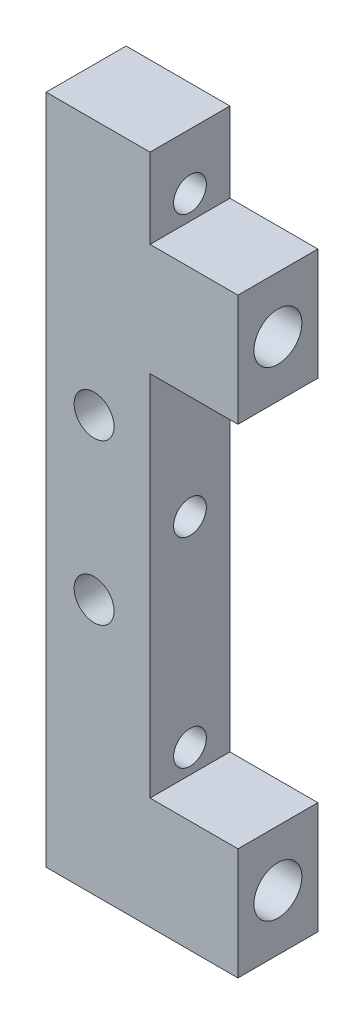
ISO-10303-21;
HEADER;
FILE_DESCRIPTION(('STEP AP214'),'2;1');
FILE_NAME('part.step','',(''),(''),'','','');
FILE_SCHEMA(('AUTOMOTIVE_DESIGN { 1 0 10303 214 1 1 1 1 }'));
ENDSEC;
DATA;
#1=APPLICATION_CONTEXT('core data for automotive mechanical design processes');
#2=APPLICATION_PROTOCOL_DEFINITION('international standard','automotive_design',2000,#1);
#3=PRODUCT_CONTEXT('',#1,'mechanical');
#4=PRODUCT('Part','Part','',(#3));
#5=PRODUCT_RELATED_PRODUCT_CATEGORY('part','',(#4));
#6=PRODUCT_DEFINITION_FORMATION('','',#4);
#7=PRODUCT_DEFINITION_CONTEXT('part definition',#1,'design');
#8=PRODUCT_DEFINITION('design','',#6,#7);
#9=PRODUCT_DEFINITION_SHAPE('','',#8);
#10=(LENGTH_UNIT() NAMED_UNIT(*) SI_UNIT(.MILLI.,.METRE.));
#11=(NAMED_UNIT(*) PLANE_ANGLE_UNIT() SI_UNIT($,.RADIAN.));
#12=(NAMED_UNIT(*) SI_UNIT($,.STERADIAN.) SOLID_ANGLE_UNIT());
#13=UNCERTAINTY_MEASURE_WITH_UNIT(LENGTH_MEASURE(1.E-05),#10,'distance_accuracy_value','');
#14=(GEOMETRIC_REPRESENTATION_CONTEXT(3) GLOBAL_UNCERTAINTY_ASSIGNED_CONTEXT((#13)) GLOBAL_UNIT_ASSIGNED_CONTEXT((#10,
#11,#12)) REPRESENTATION_CONTEXT('',''));
#15=CARTESIAN_POINT('',(0.,0.,0.));
#16=DIRECTION('',(0.,0.,1.));
#17=DIRECTION('',(1.,0.,0.));
#18=AXIS2_PLACEMENT_3D('',#15,#16,#17);
#19=CARTESIAN_POINT('',(6.,-21.,2.5));
#20=DIRECTION('',(1.,0.,0.));
#21=DIRECTION('',(0.,0.,-1.));
#22=AXIS2_PLACEMENT_3D('',#19,#20,#21);
#23=PLANE('',#22);
#24=CARTESIAN_POINT('',(6.,-17.5,0.));
#25=DIRECTION('',(1.,0.,0.));
#26=DIRECTION('',(0.,0.,-1.));
#27=AXIS2_PLACEMENT_3D('',#24,#25,#26);
#28=CIRCLE('',#27,1.49999999999999);
#29=CARTESIAN_POINT('',(6.,-17.5,-1.50000000000008));
#30=VERTEX_POINT('',#29);
#31=EDGE_CURVE('E182',#30,#30,#28,.T.);
#32=ORIENTED_EDGE('',*,*,#31,.F.);
#33=EDGE_LOOP('',(#32));
#34=FACE_BOUND('',#33,.T.);
#35=DIRECTION('',(0.,1.,0.));
#36=VECTOR('',#35,1.);
#37=CARTESIAN_POINT('',(6.,21.,-2.5));
#38=LINE('',#37,#36);
#39=CARTESIAN_POINT('',(6.,-21.,-2.5));
#40=VERTEX_POINT('',#39);
#41=CARTESIAN_POINT('',(6.,-14.,-2.5));
#42=VERTEX_POINT('',#41);
#43=EDGE_CURVE('E194',#40,#42,#38,.T.);
#44=ORIENTED_EDGE('',*,*,#43,.T.);
#45=DIRECTION('',(0.,0.,-1.));
#46=VECTOR('',#45,1.);
#47=CARTESIAN_POINT('',(6.,-14.,2.5));
#48=LINE('',#47,#46);
#49=CARTESIAN_POINT('',(6.,-14.,2.5));
#50=VERTEX_POINT('',#49);
#51=EDGE_CURVE('E152',#50,#42,#48,.T.);
#52=ORIENTED_EDGE('',*,*,#51,.F.);
#53=DIRECTION('',(0.,-1.,0.));
#54=VECTOR('',#53,1.);
#55=CARTESIAN_POINT('',(6.,21.,2.5));
#56=LINE('',#55,#54);
#57=CARTESIAN_POINT('',(6.,-21.,2.5));
#58=VERTEX_POINT('',#57);
#59=EDGE_CURVE('E188',#50,#58,#56,.T.);
#60=ORIENTED_EDGE('',*,*,#59,.T.);
#61=DIRECTION('',(0.,0.,-1.));
#62=VECTOR('',#61,1.);
#63=CARTESIAN_POINT('',(6.,-21.,2.5));
#64=LINE('',#63,#62);
#65=EDGE_CURVE('E191',#58,#40,#64,.T.);
#66=ORIENTED_EDGE('',*,*,#65,.T.);
#67=EDGE_LOOP('',(#44,#52,#60,#66));
#68=FACE_BOUND('',#67,.T.);
#69=ADVANCED_FACE('F32',(#34,#68),#23,.T.);
#70=CARTESIAN_POINT('',(6.,12.5,-3.59157148466238E-13));
#71=DIRECTION('',(1.,0.,0.));
#72=DIRECTION('',(0.,0.,-1.));
#73=AXIS2_PLACEMENT_3D('',#70,#71,#72);
#74=CIRCLE('',#73,1.49999999999959);
#75=CARTESIAN_POINT('',(6.,12.5,-1.49999999999995));
#76=VERTEX_POINT('',#75);
#77=EDGE_CURVE('E176',#76,#76,#74,.T.);
#78=ORIENTED_EDGE('',*,*,#77,.F.);
#79=EDGE_LOOP('',(#78));
#80=FACE_BOUND('',#79,.T.);
#81=CARTESIAN_POINT('',(6.,16.,2.5));
#82=VERTEX_POINT('',#81);
#83=CARTESIAN_POINT('',(6.,9.,2.5));
#84=VERTEX_POINT('',#83);
#85=EDGE_CURVE('E131',#82,#84,#56,.T.);
#86=ORIENTED_EDGE('',*,*,#85,.T.);
#87=DIRECTION('',(0.,0.,-1.));
#88=VECTOR('',#87,1.);
#89=CARTESIAN_POINT('',(6.,9.,2.5));
#90=LINE('',#89,#88);
#91=CARTESIAN_POINT('',(6.,9.,-2.5));
#92=VERTEX_POINT('',#91);
#93=EDGE_CURVE('E159',#84,#92,#90,.T.);
#94=ORIENTED_EDGE('',*,*,#93,.T.);
#95=CARTESIAN_POINT('',(6.,16.,-2.5));
#96=VERTEX_POINT('',#95);
#97=EDGE_CURVE('E193',#92,#96,#38,.T.);
#98=ORIENTED_EDGE('',*,*,#97,.T.);
#99=DIRECTION('',(0.,0.,-1.));
#100=VECTOR('',#99,1.);
#101=CARTESIAN_POINT('',(6.,16.,2.5));
#102=LINE('',#101,#100);
#103=EDGE_CURVE('E117',#82,#96,#102,.T.);
#104=ORIENTED_EDGE('',*,*,#103,.F.);
#105=EDGE_LOOP('',(#86,#94,#98,#104));
#106=FACE_BOUND('',#105,.T.);
#107=ADVANCED_FACE('F229',(#80,#106),#23,.T.);
#108=CARTESIAN_POINT('',(6.,21.,2.5));
#109=DIRECTION('',(0.,0.,-1.));
#110=DIRECTION('',(0.,1.,0.));
#111=AXIS2_PLACEMENT_3D('',#108,#109,#110);
#112=PLANE('',#111);
#113=CARTESIAN_POINT('',(-3.,5.,2.5));
#114=DIRECTION('',(0.,0.,-1.));
#115=DIRECTION('',(0.,1.,0.));
#116=AXIS2_PLACEMENT_3D('',#113,#114,#115);
#117=CIRCLE('',#116,1.25);
#118=CARTESIAN_POINT('',(-3.,6.25,2.5));
#119=VERTEX_POINT('',#118);
#120=EDGE_CURVE('E166',#119,#119,#117,.T.);
#121=ORIENTED_EDGE('',*,*,#120,.T.);
#122=EDGE_LOOP('',(#121));
#123=FACE_BOUND('',#122,.T.);
#124=CARTESIAN_POINT('',(-3.,-5.,2.5));
#125=DIRECTION('',(0.,0.,-1.));
#126=DIRECTION('',(0.,1.,0.));
#127=AXIS2_PLACEMENT_3D('',#124,#125,#126);
#128=CIRCLE('',#127,1.25);
#129=CARTESIAN_POINT('',(-3.,-3.75,2.5));
#130=VERTEX_POINT('',#129);
#131=EDGE_CURVE('E172',#130,#130,#128,.T.);
#132=ORIENTED_EDGE('',*,*,#131,.T.);
#133=EDGE_LOOP('',(#132));
#134=FACE_BOUND('',#133,.T.);
#135=DIRECTION('',(1.,0.,0.));
#136=VECTOR('',#135,1.);
#137=CARTESIAN_POINT('',(0.499999999999998,-14.,2.5));
#138=LINE('',#137,#136);
#139=CARTESIAN_POINT('',(0.499999999999998,-14.,2.5));
#140=VERTEX_POINT('',#139);
#141=EDGE_CURVE('E141',#140,#50,#138,.T.);
#142=ORIENTED_EDGE('',*,*,#141,.F.);
#143=DIRECTION('',(0.,-1.,0.));
#144=VECTOR('',#143,1.);
#145=CARTESIAN_POINT('',(0.5,9.,2.5));
#146=LINE('',#145,#144);
#147=CARTESIAN_POINT('',(0.5,9.,2.5));
#148=VERTEX_POINT('',#147);
#149=EDGE_CURVE('E135',#148,#140,#146,.T.);
#150=ORIENTED_EDGE('',*,*,#149,.F.);
#151=DIRECTION('',(-1.,0.,0.));
#152=VECTOR('',#151,1.);
#153=CARTESIAN_POINT('',(6.,9.,2.5));
#154=LINE('',#153,#152);
#155=EDGE_CURVE('E132',#84,#148,#154,.T.);
#156=ORIENTED_EDGE('',*,*,#155,.F.);
#157=ORIENTED_EDGE('',*,*,#85,.F.);
#158=DIRECTION('',(1.,0.,0.));
#159=VECTOR('',#158,1.);
#160=CARTESIAN_POINT('',(0.500000000000001,16.,2.5));
#161=LINE('',#160,#159);
#162=CARTESIAN_POINT('',(0.500000000000001,16.,2.5));
#163=VERTEX_POINT('',#162);
#164=EDGE_CURVE('E113',#163,#82,#161,.T.);
#165=ORIENTED_EDGE('',*,*,#164,.F.);
#166=DIRECTION('',(0.,-1.,0.));
#167=VECTOR('',#166,1.);
#168=CARTESIAN_POINT('',(0.500000000000002,21.,2.5));
#169=LINE('',#168,#167);
#170=CARTESIAN_POINT('',(0.500000000000002,21.,2.5));
#171=VERTEX_POINT('',#170);
#172=EDGE_CURVE('E121',#171,#163,#169,.T.);
#173=ORIENTED_EDGE('',*,*,#172,.F.);
#174=DIRECTION('',(-1.,0.,0.));
#175=VECTOR('',#174,1.);
#176=CARTESIAN_POINT('',(6.,21.,2.5));
#177=LINE('',#176,#175);
#178=CARTESIAN_POINT('',(-6.,21.,2.5));
#179=VERTEX_POINT('',#178);
#180=EDGE_CURVE('E197',#171,#179,#177,.T.);
#181=ORIENTED_EDGE('',*,*,#180,.T.);
#182=DIRECTION('',(0.,-1.,0.));
#183=VECTOR('',#182,1.);
#184=CARTESIAN_POINT('',(-6.,21.,2.5));
#185=LINE('',#184,#183);
#186=CARTESIAN_POINT('',(-6.,-21.,2.5));
#187=VERTEX_POINT('',#186);
#188=EDGE_CURVE('E185',#179,#187,#185,.T.);
#189=ORIENTED_EDGE('',*,*,#188,.T.);
#190=DIRECTION('',(-1.,0.,0.));
#191=VECTOR('',#190,1.);
#192=CARTESIAN_POINT('',(6.,-21.,2.5));
#193=LINE('',#192,#191);
#194=EDGE_CURVE('E12',#58,#187,#193,.T.);
#195=ORIENTED_EDGE('',*,*,#194,.F.);
#196=ORIENTED_EDGE('',*,*,#59,.F.);
#197=EDGE_LOOP('',(#142,#150,#156,#157,#165,#173,#181,#189,#195,#196));
#198=FACE_BOUND('',#197,.T.);
#199=ADVANCED_FACE('F34',(#123,#134,#198),#112,.F.);
#200=CARTESIAN_POINT('',(6.,21.,-2.5));
#201=DIRECTION('',(0.,0.,1.));
#202=DIRECTION('',(0.,-1.,0.));
#203=AXIS2_PLACEMENT_3D('',#200,#201,#202);
#204=PLANE('',#203);
#205=CARTESIAN_POINT('',(-3.,5.,-2.5));
#206=DIRECTION('',(0.,0.,-1.));
#207=DIRECTION('',(0.,1.,0.));
#208=AXIS2_PLACEMENT_3D('',#205,#206,#207);
#209=CIRCLE('',#208,1.25);
#210=CARTESIAN_POINT('',(-3.,6.25,-2.5));
#211=VERTEX_POINT('',#210);
#212=EDGE_CURVE('E154',#211,#211,#209,.T.);
#213=ORIENTED_EDGE('',*,*,#212,.F.);
#214=EDGE_LOOP('',(#213));
#215=FACE_BOUND('',#214,.T.);
#216=CARTESIAN_POINT('',(-3.,-5.,-2.5));
#217=DIRECTION('',(0.,0.,-1.));
#218=DIRECTION('',(0.,1.,0.));
#219=AXIS2_PLACEMENT_3D('',#216,#217,#218);
#220=CIRCLE('',#219,1.25);
#221=CARTESIAN_POINT('',(-3.,-3.75,-2.5));
#222=VERTEX_POINT('',#221);
#223=EDGE_CURVE('E169',#222,#222,#220,.T.);
#224=ORIENTED_EDGE('',*,*,#223,.F.);
#225=EDGE_LOOP('',(#224));
#226=FACE_BOUND('',#225,.T.);
#227=DIRECTION('',(1.,0.,0.));
#228=VECTOR('',#227,1.);
#229=CARTESIAN_POINT('',(0.499999999999998,-14.,-2.5));
#230=LINE('',#229,#228);
#231=CARTESIAN_POINT('',(0.499999999999998,-14.,-2.5));
#232=VERTEX_POINT('',#231);
#233=EDGE_CURVE('E125',#232,#42,#230,.T.);
#234=ORIENTED_EDGE('',*,*,#233,.T.);
#235=ORIENTED_EDGE('',*,*,#43,.F.);
#236=DIRECTION('',(-1.,0.,0.));
#237=VECTOR('',#236,1.);
#238=CARTESIAN_POINT('',(6.,-21.,-2.5));
#239=LINE('',#238,#237);
#240=CARTESIAN_POINT('',(-6.,-21.,-2.5));
#241=VERTEX_POINT('',#240);
#242=EDGE_CURVE('E41',#40,#241,#239,.T.);
#243=ORIENTED_EDGE('',*,*,#242,.T.);
#244=DIRECTION('',(0.,1.,0.));
#245=VECTOR('',#244,1.);
#246=CARTESIAN_POINT('',(-6.,21.,-2.5));
#247=LINE('',#246,#245);
#248=CARTESIAN_POINT('',(-6.,21.,-2.5));
#249=VERTEX_POINT('',#248);
#250=EDGE_CURVE('E202',#241,#249,#247,.T.);
#251=ORIENTED_EDGE('',*,*,#250,.T.);
#252=DIRECTION('',(-1.,0.,0.));
#253=VECTOR('',#252,1.);
#254=CARTESIAN_POINT('',(6.,21.,-2.5));
#255=LINE('',#254,#253);
#256=CARTESIAN_POINT('',(0.500000000000002,21.,-2.5));
#257=VERTEX_POINT('',#256);
#258=EDGE_CURVE('E208',#257,#249,#255,.T.);
#259=ORIENTED_EDGE('',*,*,#258,.F.);
#260=DIRECTION('',(0.,-1.,0.));
#261=VECTOR('',#260,1.);
#262=CARTESIAN_POINT('',(0.500000000000002,21.,-2.5));
#263=LINE('',#262,#261);
#264=CARTESIAN_POINT('',(0.500000000000001,16.,-2.5));
#265=VERTEX_POINT('',#264);
#266=EDGE_CURVE('E56',#257,#265,#263,.T.);
#267=ORIENTED_EDGE('',*,*,#266,.T.);
#268=DIRECTION('',(1.,0.,0.));
#269=VECTOR('',#268,1.);
#270=CARTESIAN_POINT('',(0.500000000000001,16.,-2.5));
#271=LINE('',#270,#269);
#272=EDGE_CURVE('E116',#265,#96,#271,.T.);
#273=ORIENTED_EDGE('',*,*,#272,.T.);
#274=ORIENTED_EDGE('',*,*,#97,.F.);
#275=DIRECTION('',(-1.,0.,0.));
#276=VECTOR('',#275,1.);
#277=CARTESIAN_POINT('',(6.,9.,-2.5));
#278=LINE('',#277,#276);
#279=CARTESIAN_POINT('',(0.5,9.,-2.5));
#280=VERTEX_POINT('',#279);
#281=EDGE_CURVE('E146',#92,#280,#278,.T.);
#282=ORIENTED_EDGE('',*,*,#281,.T.);
#283=DIRECTION('',(0.,-1.,0.));
#284=VECTOR('',#283,1.);
#285=CARTESIAN_POINT('',(0.5,9.,-2.5));
#286=LINE('',#285,#284);
#287=EDGE_CURVE('E48',#280,#232,#286,.T.);
#288=ORIENTED_EDGE('',*,*,#287,.T.);
#289=EDGE_LOOP('',(#234,#235,#243,#251,#259,#267,#273,#274,#282,#288));
#290=FACE_BOUND('',#289,.T.);
#291=ADVANCED_FACE('F215',(#215,#226,#290),#204,.F.);
#292=CARTESIAN_POINT('',(6.,21.,2.5));
#293=DIRECTION('',(0.,-1.,0.));
#294=DIRECTION('',(0.,0.,-1.));
#295=AXIS2_PLACEMENT_3D('',#292,#293,#294);
#296=PLANE('',#295);
#297=DIRECTION('',(0.,0.,-1.));
#298=VECTOR('',#297,1.);
#299=CARTESIAN_POINT('',(0.500000000000002,21.,2.5));
#300=LINE('',#299,#298);
#301=EDGE_CURVE('E118',#171,#257,#300,.T.);
#302=ORIENTED_EDGE('',*,*,#301,.T.);
#303=ORIENTED_EDGE('',*,*,#258,.T.);
#304=DIRECTION('',(0.,0.,1.));
#305=VECTOR('',#304,1.);
#306=CARTESIAN_POINT('',(-6.,21.,2.5));
#307=LINE('',#306,#305);
#308=EDGE_CURVE('E190',#249,#179,#307,.T.);
#309=ORIENTED_EDGE('',*,*,#308,.T.);
#310=ORIENTED_EDGE('',*,*,#180,.F.);
#311=EDGE_LOOP('',(#302,#303,#309,#310));
#312=FACE_BOUND('',#311,.T.);
#313=ADVANCED_FACE('F225',(#312),#296,.F.);
#314=CARTESIAN_POINT('',(-6.,-21.,2.5));
#315=DIRECTION('',(1.,0.,0.));
#316=DIRECTION('',(0.,0.,-1.));
#317=AXIS2_PLACEMENT_3D('',#314,#315,#316);
#318=PLANE('',#317);
#319=CARTESIAN_POINT('',(-6.,17.5000000000012,0.));
#320=DIRECTION('',(-1.,0.,0.));
#321=DIRECTION('',(0.,0.,1.));
#322=AXIS2_PLACEMENT_3D('',#319,#320,#321);
#323=CIRCLE('',#322,1.025);
#324=CARTESIAN_POINT('',(-6.,17.5000000000012,1.025));
#325=VERTEX_POINT('',#324);
#326=EDGE_CURVE('E320',#325,#325,#323,.T.);
#327=ORIENTED_EDGE('',*,*,#326,.F.);
#328=EDGE_LOOP('',(#327));
#329=FACE_BOUND('',#328,.T.);
#330=CARTESIAN_POINT('',(-6.,0.,0.));
#331=DIRECTION('',(-1.,0.,0.));
#332=DIRECTION('',(0.,0.,1.));
#333=AXIS2_PLACEMENT_3D('',#330,#331,#332);
#334=CIRCLE('',#333,1.025);
#335=CARTESIAN_POINT('',(-6.,0.,1.025));
#336=VERTEX_POINT('',#335);
#337=EDGE_CURVE('E322',#336,#336,#334,.T.);
#338=ORIENTED_EDGE('',*,*,#337,.F.);
#339=EDGE_LOOP('',(#338));
#340=FACE_BOUND('',#339,.T.);
#341=CARTESIAN_POINT('',(-6.,-12.5000000000001,0.));
#342=DIRECTION('',(-1.,0.,0.));
#343=DIRECTION('',(0.,0.,1.));
#344=AXIS2_PLACEMENT_3D('',#341,#342,#343);
#345=CIRCLE('',#344,1.025);
#346=CARTESIAN_POINT('',(-6.,-12.5000000000001,1.025));
#347=VERTEX_POINT('',#346);
#348=EDGE_CURVE('E327',#347,#347,#345,.T.);
#349=ORIENTED_EDGE('',*,*,#348,.F.);
#350=EDGE_LOOP('',(#349));
#351=FACE_BOUND('',#350,.T.);
#352=CARTESIAN_POINT('',(-6.,-17.5,0.));
#353=DIRECTION('',(1.,0.,0.));
#354=DIRECTION('',(0.,0.,-1.));
#355=AXIS2_PLACEMENT_3D('',#352,#353,#354);
#356=CIRCLE('',#355,1.49999999999999);
#357=CARTESIAN_POINT('',(-6.,-17.5,-1.50000000000008));
#358=VERTEX_POINT('',#357);
#359=EDGE_CURVE('E179',#358,#358,#356,.T.);
#360=ORIENTED_EDGE('',*,*,#359,.T.);
#361=EDGE_LOOP('',(#360));
#362=FACE_BOUND('',#361,.T.);
#363=ORIENTED_EDGE('',*,*,#188,.F.);
#364=ORIENTED_EDGE('',*,*,#308,.F.);
#365=ORIENTED_EDGE('',*,*,#250,.F.);
#366=DIRECTION('',(0.,0.,-1.));
#367=VECTOR('',#366,1.);
#368=CARTESIAN_POINT('',(-6.,-21.,2.5));
#369=LINE('',#368,#367);
#370=EDGE_CURVE('E200',#187,#241,#369,.T.);
#371=ORIENTED_EDGE('',*,*,#370,.F.);
#372=EDGE_LOOP('',(#363,#364,#365,#371));
#373=FACE_BOUND('',#372,.T.);
#374=CARTESIAN_POINT('',(-6.,12.5,-3.59157148466238E-13));
#375=DIRECTION('',(1.,0.,0.));
#376=DIRECTION('',(0.,0.,-1.));
#377=AXIS2_PLACEMENT_3D('',#374,#375,#376);
#378=CIRCLE('',#377,1.49999999999959);
#379=CARTESIAN_POINT('',(-6.,12.5,-1.49999999999995));
#380=VERTEX_POINT('',#379);
#381=EDGE_CURVE('E175',#380,#380,#378,.T.);
#382=ORIENTED_EDGE('',*,*,#381,.T.);
#383=EDGE_LOOP('',(#382));
#384=FACE_BOUND('',#383,.T.);
#385=ADVANCED_FACE('F222',(#329,#340,#351,#362,#373,#384),#318,.F.);
#386=CARTESIAN_POINT('',(6.,-21.,2.5));
#387=DIRECTION('',(0.,1.,0.));
#388=DIRECTION('',(0.,0.,1.));
#389=AXIS2_PLACEMENT_3D('',#386,#387,#388);
#390=PLANE('',#389);
#391=ORIENTED_EDGE('',*,*,#370,.T.);
#392=ORIENTED_EDGE('',*,*,#242,.F.);
#393=ORIENTED_EDGE('',*,*,#65,.F.);
#394=ORIENTED_EDGE('',*,*,#194,.T.);
#395=EDGE_LOOP('',(#391,#392,#393,#394));
#396=FACE_BOUND('',#395,.T.);
#397=ADVANCED_FACE('F240',(#396),#390,.F.);
#398=CARTESIAN_POINT('',(6.,-17.5,0.));
#399=DIRECTION('',(-1.,0.,0.));
#400=DIRECTION('',(0.,0.,1.));
#401=AXIS2_PLACEMENT_3D('',#398,#399,#400);
#402=CYLINDRICAL_SURFACE('',#401,1.49999999999999);
#403=ORIENTED_EDGE('',*,*,#31,.T.);
#404=EDGE_LOOP('',(#403));
#405=FACE_BOUND('',#404,.T.);
#406=ORIENTED_EDGE('',*,*,#359,.F.);
#407=EDGE_LOOP('',(#406));
#408=FACE_BOUND('',#407,.T.);
#409=ADVANCED_FACE('F242',(#405,#408),#402,.F.);
#410=CARTESIAN_POINT('',(6.,12.5,-3.59157148466238E-13));
#411=DIRECTION('',(-1.,0.,0.));
#412=DIRECTION('',(0.,0.,1.));
#413=AXIS2_PLACEMENT_3D('',#410,#411,#412);
#414=CYLINDRICAL_SURFACE('',#413,1.49999999999959);
#415=ORIENTED_EDGE('',*,*,#77,.T.);
#416=EDGE_LOOP('',(#415));
#417=FACE_BOUND('',#416,.T.);
#418=ORIENTED_EDGE('',*,*,#381,.F.);
#419=EDGE_LOOP('',(#418));
#420=FACE_BOUND('',#419,.T.);
#421=ADVANCED_FACE('F247',(#417,#420),#414,.F.);
#422=CARTESIAN_POINT('',(-3.,-5.,-2.5));
#423=DIRECTION('',(0.,0.,-1.));
#424=DIRECTION('',(0.,1.,0.));
#425=AXIS2_PLACEMENT_3D('',#422,#423,#424);
#426=CYLINDRICAL_SURFACE('',#425,1.25);
#427=ORIENTED_EDGE('',*,*,#131,.F.);
#428=EDGE_LOOP('',(#427));
#429=FACE_BOUND('',#428,.T.);
#430=ORIENTED_EDGE('',*,*,#223,.T.);
#431=EDGE_LOOP('',(#430));
#432=FACE_BOUND('',#431,.T.);
#433=ADVANCED_FACE('F274',(#429,#432),#426,.F.);
#434=CARTESIAN_POINT('',(-3.,5.,-2.5));
#435=DIRECTION('',(0.,0.,-1.));
#436=DIRECTION('',(0.,1.,0.));
#437=AXIS2_PLACEMENT_3D('',#434,#435,#436);
#438=CYLINDRICAL_SURFACE('',#437,1.25);
#439=ORIENTED_EDGE('',*,*,#120,.F.);
#440=EDGE_LOOP('',(#439));
#441=FACE_BOUND('',#440,.T.);
#442=ORIENTED_EDGE('',*,*,#212,.T.);
#443=EDGE_LOOP('',(#442));
#444=FACE_BOUND('',#443,.T.);
#445=ADVANCED_FACE('F276',(#441,#444),#438,.F.);
#446=CARTESIAN_POINT('',(0.500000000000002,21.,2.5));
#447=DIRECTION('',(1.,0.,0.));
#448=DIRECTION('',(0.,1.,0.));
#449=AXIS2_PLACEMENT_3D('',#446,#447,#448);
#450=PLANE('',#449);
#451=CARTESIAN_POINT('',(0.500000000000001,17.5000000000012,0.));
#452=DIRECTION('',(1.,0.,0.));
#453=DIRECTION('',(0.,1.,0.));
#454=AXIS2_PLACEMENT_3D('',#451,#452,#453);
#455=CIRCLE('',#454,1.025);
#456=CARTESIAN_POINT('',(0.500000000000002,18.5250000000012,0.));
#457=VERTEX_POINT('',#456);
#458=EDGE_CURVE('E317',#457,#457,#455,.T.);
#459=ORIENTED_EDGE('',*,*,#458,.F.);
#460=EDGE_LOOP('',(#459));
#461=FACE_BOUND('',#460,.T.);
#462=ORIENTED_EDGE('',*,*,#266,.F.);
#463=ORIENTED_EDGE('',*,*,#301,.F.);
#464=ORIENTED_EDGE('',*,*,#172,.T.);
#465=DIRECTION('',(0.,0.,-1.));
#466=VECTOR('',#465,1.);
#467=CARTESIAN_POINT('',(0.500000000000001,16.,2.5));
#468=LINE('',#467,#466);
#469=EDGE_CURVE('E109',#163,#265,#468,.T.);
#470=ORIENTED_EDGE('',*,*,#469,.T.);
#471=EDGE_LOOP('',(#462,#463,#464,#470));
#472=FACE_BOUND('',#471,.T.);
#473=ADVANCED_FACE('F122',(#461,#472),#450,.T.);
#474=CARTESIAN_POINT('',(0.500000000000001,16.,2.5));
#475=DIRECTION('',(0.,1.,0.));
#476=DIRECTION('',(0.,0.,1.));
#477=AXIS2_PLACEMENT_3D('',#474,#475,#476);
#478=PLANE('',#477);
#479=ORIENTED_EDGE('',*,*,#272,.F.);
#480=ORIENTED_EDGE('',*,*,#469,.F.);
#481=ORIENTED_EDGE('',*,*,#164,.T.);
#482=ORIENTED_EDGE('',*,*,#103,.T.);
#483=EDGE_LOOP('',(#479,#480,#481,#482));
#484=FACE_BOUND('',#483,.T.);
#485=ADVANCED_FACE('F111',(#484),#478,.T.);
#486=CARTESIAN_POINT('',(0.499999999999998,-14.,2.5));
#487=DIRECTION('',(0.,1.,0.));
#488=DIRECTION('',(0.,0.,1.));
#489=AXIS2_PLACEMENT_3D('',#486,#487,#488);
#490=PLANE('',#489);
#491=ORIENTED_EDGE('',*,*,#233,.F.);
#492=DIRECTION('',(0.,0.,-1.));
#493=VECTOR('',#492,1.);
#494=CARTESIAN_POINT('',(0.499999999999998,-14.,2.5));
#495=LINE('',#494,#493);
#496=EDGE_CURVE('E155',#140,#232,#495,.T.);
#497=ORIENTED_EDGE('',*,*,#496,.F.);
#498=ORIENTED_EDGE('',*,*,#141,.T.);
#499=ORIENTED_EDGE('',*,*,#51,.T.);
#500=EDGE_LOOP('',(#491,#497,#498,#499));
#501=FACE_BOUND('',#500,.T.);
#502=ADVANCED_FACE('F293',(#501),#490,.T.);
#503=CARTESIAN_POINT('',(0.5,9.,2.5));
#504=DIRECTION('',(1.,0.,0.));
#505=DIRECTION('',(0.,1.,0.));
#506=AXIS2_PLACEMENT_3D('',#503,#504,#505);
#507=PLANE('',#506);
#508=CARTESIAN_POINT('',(0.5,0.,0.));
#509=DIRECTION('',(1.,0.,0.));
#510=DIRECTION('',(0.,1.,0.));
#511=AXIS2_PLACEMENT_3D('',#508,#509,#510);
#512=CIRCLE('',#511,1.025);
#513=CARTESIAN_POINT('',(0.5,1.025,0.));
#514=VERTEX_POINT('',#513);
#515=EDGE_CURVE('E36',#514,#514,#512,.T.);
#516=ORIENTED_EDGE('',*,*,#515,.F.);
#517=EDGE_LOOP('',(#516));
#518=FACE_BOUND('',#517,.T.);
#519=CARTESIAN_POINT('',(0.499999999999998,-12.5000000000001,0.));
#520=DIRECTION('',(1.,0.,0.));
#521=DIRECTION('',(0.,1.,0.));
#522=AXIS2_PLACEMENT_3D('',#519,#520,#521);
#523=CIRCLE('',#522,1.025);
#524=CARTESIAN_POINT('',(0.499999999999998,-11.4750000000001,0.));
#525=VERTEX_POINT('',#524);
#526=EDGE_CURVE('E144',#525,#525,#523,.T.);
#527=ORIENTED_EDGE('',*,*,#526,.F.);
#528=EDGE_LOOP('',(#527));
#529=FACE_BOUND('',#528,.T.);
#530=ORIENTED_EDGE('',*,*,#287,.F.);
#531=DIRECTION('',(0.,0.,-1.));
#532=VECTOR('',#531,1.);
#533=CARTESIAN_POINT('',(0.5,9.,2.5));
#534=LINE('',#533,#532);
#535=EDGE_CURVE('E157',#148,#280,#534,.T.);
#536=ORIENTED_EDGE('',*,*,#535,.F.);
#537=ORIENTED_EDGE('',*,*,#149,.T.);
#538=ORIENTED_EDGE('',*,*,#496,.T.);
#539=EDGE_LOOP('',(#530,#536,#537,#538));
#540=FACE_BOUND('',#539,.T.);
#541=ADVANCED_FACE('F234',(#518,#529,#540),#507,.T.);
#542=CARTESIAN_POINT('',(6.,9.,2.5));
#543=DIRECTION('',(0.,-1.,0.));
#544=DIRECTION('',(0.,0.,-1.));
#545=AXIS2_PLACEMENT_3D('',#542,#543,#544);
#546=PLANE('',#545);
#547=ORIENTED_EDGE('',*,*,#281,.F.);
#548=ORIENTED_EDGE('',*,*,#93,.F.);
#549=ORIENTED_EDGE('',*,*,#155,.T.);
#550=ORIENTED_EDGE('',*,*,#535,.T.);
#551=EDGE_LOOP('',(#547,#548,#549,#550));
#552=FACE_BOUND('',#551,.T.);
#553=ADVANCED_FACE('F231',(#552),#546,.T.);
#554=CARTESIAN_POINT('',(-6.,-12.5000000000001,0.));
#555=DIRECTION('',(-1.,0.,0.));
#556=DIRECTION('',(0.,0.,1.));
#557=AXIS2_PLACEMENT_3D('',#554,#555,#556);
#558=CYLINDRICAL_SURFACE('',#557,1.025);
#559=ORIENTED_EDGE('',*,*,#526,.T.);
#560=EDGE_LOOP('',(#559));
#561=FACE_BOUND('',#560,.T.);
#562=ORIENTED_EDGE('',*,*,#348,.T.);
#563=EDGE_LOOP('',(#562));
#564=FACE_BOUND('',#563,.T.);
#565=ADVANCED_FACE('F296',(#561,#564),#558,.F.);
#566=CARTESIAN_POINT('',(-6.,0.,0.));
#567=DIRECTION('',(-1.,0.,0.));
#568=DIRECTION('',(0.,0.,1.));
#569=AXIS2_PLACEMENT_3D('',#566,#567,#568);
#570=CYLINDRICAL_SURFACE('',#569,1.025);
#571=ORIENTED_EDGE('',*,*,#515,.T.);
#572=EDGE_LOOP('',(#571));
#573=FACE_BOUND('',#572,.T.);
#574=ORIENTED_EDGE('',*,*,#337,.T.);
#575=EDGE_LOOP('',(#574));
#576=FACE_BOUND('',#575,.T.);
#577=ADVANCED_FACE('F304',(#573,#576),#570,.F.);
#578=CARTESIAN_POINT('',(-6.,17.5000000000012,0.));
#579=DIRECTION('',(-1.,0.,0.));
#580=DIRECTION('',(0.,0.,1.));
#581=AXIS2_PLACEMENT_3D('',#578,#579,#580);
#582=CYLINDRICAL_SURFACE('',#581,1.025);
#583=ORIENTED_EDGE('',*,*,#458,.T.);
#584=EDGE_LOOP('',(#583));
#585=FACE_BOUND('',#584,.T.);
#586=ORIENTED_EDGE('',*,*,#326,.T.);
#587=EDGE_LOOP('',(#586));
#588=FACE_BOUND('',#587,.T.);
#589=ADVANCED_FACE('F308',(#585,#588),#582,.F.);
#590=CLOSED_SHELL('',(#69,#107,#199,#291,#313,#385,#397,#409,#421,#433,#445,#473,#485,#502,#541,
#553,#565,#577,#589));
#591=MANIFOLD_SOLID_BREP('B2',#590);
#592=ADVANCED_BREP_SHAPE_REPRESENTATION('',(#18,#591),#14);
#593=SHAPE_DEFINITION_REPRESENTATION(#9,#592);
ENDSEC;
END-ISO-10303-21;
